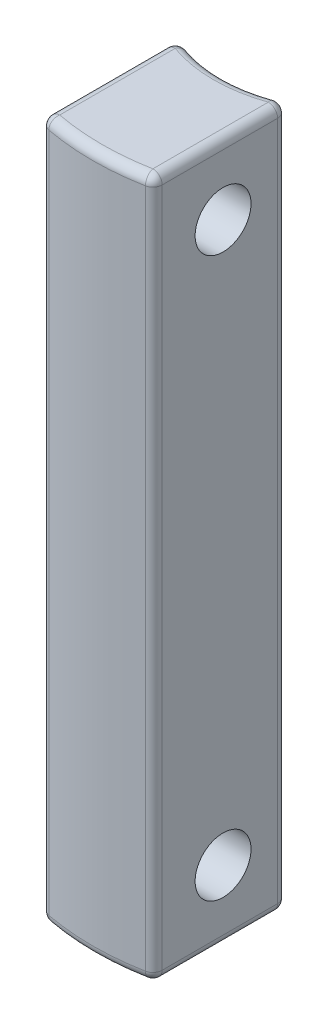
ISO-10303-21;
HEADER;
FILE_DESCRIPTION(('STEP AP214'),'2;1');
FILE_NAME('part.step','',(''),(''),'','','');
FILE_SCHEMA(('AUTOMOTIVE_DESIGN { 1 0 10303 214 1 1 1 1 }'));
ENDSEC;
DATA;
#1=APPLICATION_CONTEXT('core data for automotive mechanical design processes');
#2=APPLICATION_PROTOCOL_DEFINITION('international standard','automotive_design',2000,#1);
#3=PRODUCT_CONTEXT('',#1,'mechanical');
#4=PRODUCT('Part','Part','',(#3));
#5=PRODUCT_RELATED_PRODUCT_CATEGORY('part','',(#4));
#6=PRODUCT_DEFINITION_FORMATION('','',#4);
#7=PRODUCT_DEFINITION_CONTEXT('part definition',#1,'design');
#8=PRODUCT_DEFINITION('design','',#6,#7);
#9=PRODUCT_DEFINITION_SHAPE('','',#8);
#10=(LENGTH_UNIT() NAMED_UNIT(*) SI_UNIT(.MILLI.,.METRE.));
#11=(NAMED_UNIT(*) PLANE_ANGLE_UNIT() SI_UNIT($,.RADIAN.));
#12=(NAMED_UNIT(*) SI_UNIT($,.STERADIAN.) SOLID_ANGLE_UNIT());
#13=UNCERTAINTY_MEASURE_WITH_UNIT(LENGTH_MEASURE(1.E-05),#10,'distance_accuracy_value','');
#14=(GEOMETRIC_REPRESENTATION_CONTEXT(3) GLOBAL_UNCERTAINTY_ASSIGNED_CONTEXT((#13)) GLOBAL_UNIT_ASSIGNED_CONTEXT((#10,
#11,#12)) REPRESENTATION_CONTEXT('',''));
#15=CARTESIAN_POINT('',(0.,0.,0.));
#16=DIRECTION('',(0.,0.,1.));
#17=DIRECTION('',(1.,0.,0.));
#18=AXIS2_PLACEMENT_3D('',#15,#16,#17);
#19=CARTESIAN_POINT('',(0.,37.5,-19.9993496515141));
#20=DIRECTION('',(0.,-1.,0.));
#21=DIRECTION('',(0.,0.,-1.));
#22=AXIS2_PLACEMENT_3D('',#19,#20,#21);
#23=CYLINDRICAL_SURFACE('',#22,28.);
#24=CARTESIAN_POINT('',(0.,36.5,-19.9993496515141));
#25=DIRECTION('',(0.,1.,0.));
#26=DIRECTION('',(0.,0.,1.));
#27=AXIS2_PLACEMENT_3D('',#24,#25,#26);
#28=CIRCLE('',#27,28.);
#29=CARTESIAN_POINT('',(5.1851851851852,36.5,7.51635231291588));
#30=VERTEX_POINT('',#29);
#31=CARTESIAN_POINT('',(-5.18518518518519,36.5,7.51635231291588));
#32=VERTEX_POINT('',#31);
#33=EDGE_CURVE('E44',#30,#32,#28,.F.);
#34=ORIENTED_EDGE('',*,*,#33,.T.);
#35=DIRECTION('',(0.,-1.,0.));
#36=VECTOR('',#35,1.);
#37=CARTESIAN_POINT('',(-5.18518518518519,37.5,7.51635231291588));
#38=LINE('',#37,#36);
#39=CARTESIAN_POINT('',(-5.18518518518519,-36.5,7.51635231291588));
#40=VERTEX_POINT('',#39);
#41=EDGE_CURVE('E11',#32,#40,#38,.T.);
#42=ORIENTED_EDGE('',*,*,#41,.T.);
#43=CARTESIAN_POINT('',(0.,-36.5,-19.9993496515141));
#44=DIRECTION('',(0.,1.,0.));
#45=DIRECTION('',(0.,0.,1.));
#46=AXIS2_PLACEMENT_3D('',#43,#44,#45);
#47=CIRCLE('',#46,28.);
#48=CARTESIAN_POINT('',(5.1851851851852,-36.5,7.51635231291588));
#49=VERTEX_POINT('',#48);
#50=EDGE_CURVE('E206',#40,#49,#47,.T.);
#51=ORIENTED_EDGE('',*,*,#50,.T.);
#52=DIRECTION('',(0.,-1.,0.));
#53=VECTOR('',#52,1.);
#54=CARTESIAN_POINT('',(5.1851851851852,37.5,7.51635231291588));
#55=LINE('',#54,#53);
#56=EDGE_CURVE('E55',#49,#30,#55,.F.);
#57=ORIENTED_EDGE('',*,*,#56,.T.);
#58=EDGE_LOOP('',(#34,#42,#51,#57));
#59=FACE_BOUND('',#58,.T.);
#60=ADVANCED_FACE('F35',(#59),#23,.T.);
#61=CARTESIAN_POINT('',(6.00000000000001,37.5,7.35023901084058));
#62=DIRECTION('',(-1.,0.,0.));
#63=DIRECTION('',(0.,0.,1.));
#64=AXIS2_PLACEMENT_3D('',#61,#62,#63);
#65=PLANE('',#64);
#66=DIRECTION('',(0.,0.,-1.));
#67=VECTOR('',#66,1.);
#68=CARTESIAN_POINT('',(6.00000000000001,-36.5,7.35023901084058));
#69=LINE('',#68,#67);
#70=CARTESIAN_POINT('',(6.00000000000001,-36.5,6.53364867132909));
#71=VERTEX_POINT('',#70);
#72=CARTESIAN_POINT('',(6.00000000000001,-36.5,-5.85721402778315));
#73=VERTEX_POINT('',#72);
#74=EDGE_CURVE('E176',#71,#73,#69,.T.);
#75=ORIENTED_EDGE('',*,*,#74,.T.);
#76=DIRECTION('',(0.,-1.,0.));
#77=VECTOR('',#76,1.);
#78=CARTESIAN_POINT('',(6.00000000000001,37.5,-5.85721402778315));
#79=LINE('',#78,#77);
#80=CARTESIAN_POINT('',(6.00000000000001,36.5,-5.85721402778315));
#81=VERTEX_POINT('',#80);
#82=EDGE_CURVE('E178',#73,#81,#79,.F.);
#83=ORIENTED_EDGE('',*,*,#82,.T.);
#84=DIRECTION('',(0.,0.,-1.));
#85=VECTOR('',#84,1.);
#86=CARTESIAN_POINT('',(6.00000000000001,36.5,7.35023901084058));
#87=LINE('',#86,#85);
#88=CARTESIAN_POINT('',(6.00000000000001,36.5,6.53364867132909));
#89=VERTEX_POINT('',#88);
#90=EDGE_CURVE('E174',#81,#89,#87,.F.);
#91=ORIENTED_EDGE('',*,*,#90,.T.);
#92=DIRECTION('',(0.,-1.,0.));
#93=VECTOR('',#92,1.);
#94=CARTESIAN_POINT('',(6.00000000000001,37.5,6.53364867132909));
#95=LINE('',#94,#93);
#96=EDGE_CURVE('E172',#89,#71,#95,.T.);
#97=ORIENTED_EDGE('',*,*,#96,.T.);
#98=EDGE_LOOP('',(#75,#83,#91,#97));
#99=FACE_BOUND('',#98,.T.);
#100=CARTESIAN_POINT('',(6.00000000000001,30.,0.));
#101=DIRECTION('',(1.,0.,0.));
#102=DIRECTION('',(0.,0.,-1.));
#103=AXIS2_PLACEMENT_3D('',#100,#101,#102);
#104=CIRCLE('',#103,3.);
#105=CARTESIAN_POINT('',(6.00000000000001,30.,-3.00000000000001));
#106=VERTEX_POINT('',#105);
#107=EDGE_CURVE('E164',#106,#106,#104,.T.);
#108=ORIENTED_EDGE('',*,*,#107,.F.);
#109=EDGE_LOOP('',(#108));
#110=FACE_BOUND('',#109,.T.);
#111=CARTESIAN_POINT('',(6.00000000000001,-30.,0.));
#112=DIRECTION('',(1.,0.,0.));
#113=DIRECTION('',(0.,0.,-1.));
#114=AXIS2_PLACEMENT_3D('',#111,#112,#113);
#115=CIRCLE('',#114,3.);
#116=CARTESIAN_POINT('',(6.00000000000001,-30.,-3.00000000000001));
#117=VERTEX_POINT('',#116);
#118=EDGE_CURVE('E264',#117,#117,#115,.T.);
#119=ORIENTED_EDGE('',*,*,#118,.F.);
#120=EDGE_LOOP('',(#119));
#121=FACE_BOUND('',#120,.T.);
#122=ADVANCED_FACE('F279',(#99,#110,#121),#65,.F.);
#123=CARTESIAN_POINT('',(0.,37.5,-19.9993496515141));
#124=DIRECTION('',(0.,-1.,0.));
#125=DIRECTION('',(0.,0.,-1.));
#126=AXIS2_PLACEMENT_3D('',#123,#124,#125);
#127=CYLINDRICAL_SURFACE('',#126,14.);
#128=DIRECTION('',(0.,-1.,0.));
#129=VECTOR('',#128,1.);
#130=CARTESIAN_POINT('',(4.66666666666667,37.5,-6.80002306936522));
#131=LINE('',#130,#129);
#132=CARTESIAN_POINT('',(4.66666666666667,36.5,-6.80002306936522));
#133=VERTEX_POINT('',#132);
#134=CARTESIAN_POINT('',(4.66666666666667,-36.5,-6.80002306936522));
#135=VERTEX_POINT('',#134);
#136=EDGE_CURVE('E134',#133,#135,#131,.T.);
#137=ORIENTED_EDGE('',*,*,#136,.T.);
#138=CARTESIAN_POINT('',(0.,-36.5,-19.9993496515141));
#139=DIRECTION('',(0.,1.,0.));
#140=DIRECTION('',(0.,0.,1.));
#141=AXIS2_PLACEMENT_3D('',#138,#139,#140);
#142=CIRCLE('',#141,14.);
#143=CARTESIAN_POINT('',(-4.66666666666667,-36.5,-6.80002306936521));
#144=VERTEX_POINT('',#143);
#145=EDGE_CURVE('E130',#135,#144,#142,.F.);
#146=ORIENTED_EDGE('',*,*,#145,.T.);
#147=DIRECTION('',(0.,-1.,0.));
#148=VECTOR('',#147,1.);
#149=CARTESIAN_POINT('',(-4.66666666666667,37.5,-6.80002306936521));
#150=LINE('',#149,#148);
#151=CARTESIAN_POINT('',(-4.66666666666667,36.5,-6.80002306936521));
#152=VERTEX_POINT('',#151);
#153=EDGE_CURVE('E122',#144,#152,#150,.F.);
#154=ORIENTED_EDGE('',*,*,#153,.T.);
#155=CARTESIAN_POINT('',(0.,36.5,-19.9993496515141));
#156=DIRECTION('',(0.,1.,0.));
#157=DIRECTION('',(0.,0.,1.));
#158=AXIS2_PLACEMENT_3D('',#155,#156,#157);
#159=CIRCLE('',#158,14.);
#160=EDGE_CURVE('E127',#152,#133,#159,.T.);
#161=ORIENTED_EDGE('',*,*,#160,.T.);
#162=EDGE_LOOP('',(#137,#146,#154,#161));
#163=FACE_BOUND('',#162,.T.);
#164=ADVANCED_FACE('F125',(#163),#127,.F.);
#165=CARTESIAN_POINT('',(-6.,37.5,7.35023901084058));
#166=DIRECTION('',(1.,0.,0.));
#167=DIRECTION('',(0.,0.,-1.));
#168=AXIS2_PLACEMENT_3D('',#165,#166,#167);
#169=PLANE('',#168);
#170=DIRECTION('',(0.,0.,1.));
#171=VECTOR('',#170,1.);
#172=CARTESIAN_POINT('',(-6.,36.5,-7.35023901084058));
#173=LINE('',#172,#171);
#174=CARTESIAN_POINT('',(-6.,36.5,6.5336486713291));
#175=VERTEX_POINT('',#174);
#176=CARTESIAN_POINT('',(-6.,36.5,-5.85721402778315));
#177=VERTEX_POINT('',#176);
#178=EDGE_CURVE('E183',#175,#177,#173,.F.);
#179=ORIENTED_EDGE('',*,*,#178,.T.);
#180=DIRECTION('',(0.,-1.,0.));
#181=VECTOR('',#180,1.);
#182=CARTESIAN_POINT('',(-6.,37.5,-5.85721402778315));
#183=LINE('',#182,#181);
#184=CARTESIAN_POINT('',(-6.,-36.5,-5.85721402778315));
#185=VERTEX_POINT('',#184);
#186=EDGE_CURVE('E142',#177,#185,#183,.T.);
#187=ORIENTED_EDGE('',*,*,#186,.T.);
#188=DIRECTION('',(0.,0.,1.));
#189=VECTOR('',#188,1.);
#190=CARTESIAN_POINT('',(-6.,-36.5,7.35023901084058));
#191=LINE('',#190,#189);
#192=CARTESIAN_POINT('',(-6.,-36.5,6.5336486713291));
#193=VERTEX_POINT('',#192);
#194=EDGE_CURVE('E185',#185,#193,#191,.T.);
#195=ORIENTED_EDGE('',*,*,#194,.T.);
#196=DIRECTION('',(0.,-1.,0.));
#197=VECTOR('',#196,1.);
#198=CARTESIAN_POINT('',(-6.,37.5,6.5336486713291));
#199=LINE('',#198,#197);
#200=EDGE_CURVE('E181',#193,#175,#199,.F.);
#201=ORIENTED_EDGE('',*,*,#200,.T.);
#202=EDGE_LOOP('',(#179,#187,#195,#201));
#203=FACE_BOUND('',#202,.T.);
#204=CARTESIAN_POINT('',(-6.,30.,0.));
#205=DIRECTION('',(1.,0.,0.));
#206=DIRECTION('',(0.,0.,-1.));
#207=AXIS2_PLACEMENT_3D('',#204,#205,#206);
#208=CIRCLE('',#207,3.);
#209=CARTESIAN_POINT('',(-6.,30.,-3.00000000000001));
#210=VERTEX_POINT('',#209);
#211=EDGE_CURVE('E161',#210,#210,#208,.T.);
#212=ORIENTED_EDGE('',*,*,#211,.T.);
#213=EDGE_LOOP('',(#212));
#214=FACE_BOUND('',#213,.T.);
#215=CARTESIAN_POINT('',(-6.,-30.,0.));
#216=DIRECTION('',(1.,0.,0.));
#217=DIRECTION('',(0.,0.,-1.));
#218=AXIS2_PLACEMENT_3D('',#215,#216,#217);
#219=CIRCLE('',#218,3.);
#220=CARTESIAN_POINT('',(-6.,-30.,-3.00000000000001));
#221=VERTEX_POINT('',#220);
#222=EDGE_CURVE('E167',#221,#221,#219,.T.);
#223=ORIENTED_EDGE('',*,*,#222,.T.);
#224=EDGE_LOOP('',(#223));
#225=FACE_BOUND('',#224,.T.);
#226=ADVANCED_FACE('F288',(#203,#214,#225),#169,.F.);
#227=CARTESIAN_POINT('',(0.,37.5,-19.9993496515141));
#228=DIRECTION('',(0.,1.,0.));
#229=DIRECTION('',(0.,0.,1.));
#230=AXIS2_PLACEMENT_3D('',#227,#228,#229);
#231=PLANE('',#230);
#232=CARTESIAN_POINT('',(0.,37.5,-19.9993496515141));
#233=DIRECTION('',(0.,1.,0.));
#234=DIRECTION('',(0.,0.,1.));
#235=AXIS2_PLACEMENT_3D('',#232,#233,#234);
#236=CIRCLE('',#235,15.);
#237=CARTESIAN_POINT('',(5.00000000000001,37.5,-5.85721402778315));
#238=VERTEX_POINT('',#237);
#239=CARTESIAN_POINT('',(-5.,37.5,-5.85721402778315));
#240=VERTEX_POINT('',#239);
#241=EDGE_CURVE('E201',#238,#240,#236,.F.);
#242=ORIENTED_EDGE('',*,*,#241,.T.);
#243=DIRECTION('',(0.,0.,1.));
#244=VECTOR('',#243,1.);
#245=CARTESIAN_POINT('',(-5.,37.5,7.35023901084058));
#246=LINE('',#245,#244);
#247=CARTESIAN_POINT('',(-5.,37.5,6.5336486713291));
#248=VERTEX_POINT('',#247);
#249=EDGE_CURVE('E203',#240,#248,#246,.T.);
#250=ORIENTED_EDGE('',*,*,#249,.T.);
#251=CARTESIAN_POINT('',(0.,37.5,-19.9993496515141));
#252=DIRECTION('',(0.,1.,0.));
#253=DIRECTION('',(0.,0.,1.));
#254=AXIS2_PLACEMENT_3D('',#251,#252,#253);
#255=CIRCLE('',#254,27.);
#256=CARTESIAN_POINT('',(5.00000000000001,37.5,6.5336486713291));
#257=VERTEX_POINT('',#256);
#258=EDGE_CURVE('E197',#248,#257,#255,.T.);
#259=ORIENTED_EDGE('',*,*,#258,.T.);
#260=DIRECTION('',(0.,0.,-1.));
#261=VECTOR('',#260,1.);
#262=CARTESIAN_POINT('',(5.00000000000001,37.5,-7.35023901084059));
#263=LINE('',#262,#261);
#264=EDGE_CURVE('E199',#257,#238,#263,.T.);
#265=ORIENTED_EDGE('',*,*,#264,.T.);
#266=EDGE_LOOP('',(#242,#250,#259,#265));
#267=FACE_BOUND('',#266,.T.);
#268=ADVANCED_FACE('F385',(#267),#231,.T.);
#269=CARTESIAN_POINT('',(0.,-37.5,-19.9993496515141));
#270=DIRECTION('',(0.,1.,0.));
#271=DIRECTION('',(0.,0.,1.));
#272=AXIS2_PLACEMENT_3D('',#269,#270,#271);
#273=PLANE('',#272);
#274=CARTESIAN_POINT('',(0.,-37.5,-19.9993496515141));
#275=DIRECTION('',(0.,1.,0.));
#276=DIRECTION('',(0.,0.,1.));
#277=AXIS2_PLACEMENT_3D('',#274,#275,#276);
#278=CIRCLE('',#277,15.);
#279=CARTESIAN_POINT('',(-5.,-37.5,-5.85721402778315));
#280=VERTEX_POINT('',#279);
#281=CARTESIAN_POINT('',(5.00000000000001,-37.5,-5.85721402778315));
#282=VERTEX_POINT('',#281);
#283=EDGE_CURVE('E192',#280,#282,#278,.T.);
#284=ORIENTED_EDGE('',*,*,#283,.T.);
#285=DIRECTION('',(0.,0.,-1.));
#286=VECTOR('',#285,1.);
#287=CARTESIAN_POINT('',(5.,-37.5,-19.9993496515141));
#288=LINE('',#287,#286);
#289=CARTESIAN_POINT('',(5.00000000000001,-37.5,6.5336486713291));
#290=VERTEX_POINT('',#289);
#291=EDGE_CURVE('E194',#282,#290,#288,.F.);
#292=ORIENTED_EDGE('',*,*,#291,.T.);
#293=CARTESIAN_POINT('',(0.,-37.5,-19.9993496515141));
#294=DIRECTION('',(0.,1.,0.));
#295=DIRECTION('',(0.,0.,1.));
#296=AXIS2_PLACEMENT_3D('',#293,#294,#295);
#297=CIRCLE('',#296,27.);
#298=CARTESIAN_POINT('',(-5.,-37.5,6.5336486713291));
#299=VERTEX_POINT('',#298);
#300=EDGE_CURVE('E188',#290,#299,#297,.F.);
#301=ORIENTED_EDGE('',*,*,#300,.T.);
#302=DIRECTION('',(0.,0.,1.));
#303=VECTOR('',#302,1.);
#304=CARTESIAN_POINT('',(-5.,-37.5,-19.9993496515141));
#305=LINE('',#304,#303);
#306=EDGE_CURVE('E190',#299,#280,#305,.F.);
#307=ORIENTED_EDGE('',*,*,#306,.T.);
#308=EDGE_LOOP('',(#284,#292,#301,#307));
#309=FACE_BOUND('',#308,.T.);
#310=ADVANCED_FACE('F387',(#309),#273,.F.);
#311=CARTESIAN_POINT('',(-6.,-30.,0.));
#312=DIRECTION('',(1.,0.,0.));
#313=DIRECTION('',(0.,0.,-1.));
#314=AXIS2_PLACEMENT_3D('',#311,#312,#313);
#315=CYLINDRICAL_SURFACE('',#314,3.);
#316=ORIENTED_EDGE('',*,*,#222,.F.);
#317=EDGE_LOOP('',(#316));
#318=FACE_BOUND('',#317,.T.);
#319=ORIENTED_EDGE('',*,*,#118,.T.);
#320=EDGE_LOOP('',(#319));
#321=FACE_BOUND('',#320,.T.);
#322=ADVANCED_FACE('F393',(#318,#321),#315,.F.);
#323=CARTESIAN_POINT('',(-6.,30.,0.));
#324=DIRECTION('',(1.,0.,0.));
#325=DIRECTION('',(0.,0.,-1.));
#326=AXIS2_PLACEMENT_3D('',#323,#324,#325);
#327=CYLINDRICAL_SURFACE('',#326,3.);
#328=ORIENTED_EDGE('',*,*,#211,.F.);
#329=EDGE_LOOP('',(#328));
#330=FACE_BOUND('',#329,.T.);
#331=ORIENTED_EDGE('',*,*,#107,.T.);
#332=EDGE_LOOP('',(#331));
#333=FACE_BOUND('',#332,.T.);
#334=ADVANCED_FACE('F277',(#330,#333),#327,.F.);
#335=CARTESIAN_POINT('',(-5.,37.5,6.5336486713291));
#336=DIRECTION('',(0.,-1.,0.));
#337=DIRECTION('',(0.,0.,-1.));
#338=AXIS2_PLACEMENT_3D('',#335,#336,#337);
#339=CYLINDRICAL_SURFACE('',#338,1.);
#340=CARTESIAN_POINT('',(-5.,36.5,6.5336486713291));
#341=DIRECTION('',(0.,1.,0.));
#342=DIRECTION('',(0.,0.,1.));
#343=AXIS2_PLACEMENT_3D('',#340,#341,#342);
#344=CIRCLE('',#343,1.);
#345=EDGE_CURVE('E39',#175,#32,#344,.T.);
#346=ORIENTED_EDGE('',*,*,#345,.F.);
#347=ORIENTED_EDGE('',*,*,#200,.F.);
#348=CARTESIAN_POINT('',(-5.,-36.5,6.5336486713291));
#349=DIRECTION('',(0.,-1.,0.));
#350=DIRECTION('',(0.,0.,-1.));
#351=AXIS2_PLACEMENT_3D('',#348,#349,#350);
#352=CIRCLE('',#351,1.);
#353=EDGE_CURVE('E257',#40,#193,#352,.T.);
#354=ORIENTED_EDGE('',*,*,#353,.F.);
#355=ORIENTED_EDGE('',*,*,#41,.F.);
#356=EDGE_LOOP('',(#346,#347,#354,#355));
#357=FACE_BOUND('',#356,.T.);
#358=ADVANCED_FACE('F37',(#357),#339,.T.);
#359=CARTESIAN_POINT('',(-5.,36.5,6.5336486713291));
#360=DIRECTION('',(0.,1.,0.));
#361=DIRECTION('',(0.,0.,1.));
#362=AXIS2_PLACEMENT_3D('',#359,#360,#361);
#363=SPHERICAL_SURFACE('',#362,1.);
#364=CARTESIAN_POINT('',(-5.,36.5,6.5336486713291));
#365=DIRECTION('',(0.,0.,1.));
#366=DIRECTION('',(1.,0.,0.));
#367=AXIS2_PLACEMENT_3D('',#364,#365,#366);
#368=CIRCLE('',#367,1.);
#369=EDGE_CURVE('E252',#175,#248,#368,.F.);
#370=ORIENTED_EDGE('',*,*,#369,.F.);
#371=ORIENTED_EDGE('',*,*,#345,.T.);
#372=CARTESIAN_POINT('',(-5.,36.5,6.5336486713291));
#373=DIRECTION('',(-0.982703641586785,0.,-0.185185185185185));
#374=DIRECTION('',(-0.185185185185185,0.,0.982703641586785));
#375=AXIS2_PLACEMENT_3D('',#372,#373,#374);
#376=CIRCLE('',#375,1.);
#377=EDGE_CURVE('E255',#248,#32,#376,.F.);
#378=ORIENTED_EDGE('',*,*,#377,.F.);
#379=EDGE_LOOP('',(#370,#371,#378));
#380=FACE_BOUND('',#379,.T.);
#381=ADVANCED_FACE('F357',(#380),#363,.T.);
#382=CARTESIAN_POINT('',(-5.,-36.5,6.5336486713291));
#383=DIRECTION('',(0.,-1.,0.));
#384=DIRECTION('',(0.,0.,-1.));
#385=AXIS2_PLACEMENT_3D('',#382,#383,#384);
#386=SPHERICAL_SURFACE('',#385,1.);
#387=CARTESIAN_POINT('',(-5.,-36.5,6.5336486713291));
#388=DIRECTION('',(-0.982703641586785,0.,-0.185185185185185));
#389=DIRECTION('',(-0.185185185185185,0.,0.982703641586785));
#390=AXIS2_PLACEMENT_3D('',#387,#388,#389);
#391=CIRCLE('',#390,1.);
#392=EDGE_CURVE('E246',#40,#299,#391,.F.);
#393=ORIENTED_EDGE('',*,*,#392,.F.);
#394=ORIENTED_EDGE('',*,*,#353,.T.);
#395=CARTESIAN_POINT('',(-5.,-36.5,6.5336486713291));
#396=DIRECTION('',(0.,0.,1.));
#397=DIRECTION('',(0.,-1.,0.));
#398=AXIS2_PLACEMENT_3D('',#395,#396,#397);
#399=CIRCLE('',#398,1.);
#400=EDGE_CURVE('E249',#299,#193,#399,.F.);
#401=ORIENTED_EDGE('',*,*,#400,.F.);
#402=EDGE_LOOP('',(#393,#394,#401));
#403=FACE_BOUND('',#402,.T.);
#404=ADVANCED_FACE('F354',(#403),#386,.T.);
#405=CARTESIAN_POINT('',(0.,36.5,-19.9993496515141));
#406=DIRECTION('',(0.,1.,0.));
#407=DIRECTION('',(0.,0.,1.));
#408=AXIS2_PLACEMENT_3D('',#405,#406,#407);
#409=TOROIDAL_SURFACE('',#408,27.,1.);
#410=ORIENTED_EDGE('',*,*,#377,.T.);
#411=ORIENTED_EDGE('',*,*,#33,.F.);
#412=CARTESIAN_POINT('',(5.00000000000001,36.5,6.5336486713291));
#413=DIRECTION('',(0.982703641586785,0.,-0.185185185185186));
#414=DIRECTION('',(-0.185185185185186,0.,-0.982703641586785));
#415=AXIS2_PLACEMENT_3D('',#412,#413,#414);
#416=CIRCLE('',#415,1.);
#417=EDGE_CURVE('E240',#257,#30,#416,.T.);
#418=ORIENTED_EDGE('',*,*,#417,.F.);
#419=ORIENTED_EDGE('',*,*,#258,.F.);
#420=EDGE_LOOP('',(#410,#411,#418,#419));
#421=FACE_BOUND('',#420,.T.);
#422=ADVANCED_FACE('F350',(#421),#409,.T.);
#423=CARTESIAN_POINT('',(-5.,36.5,-19.9993496515141));
#424=DIRECTION('',(0.,0.,-1.));
#425=DIRECTION('',(-1.,0.,0.));
#426=AXIS2_PLACEMENT_3D('',#423,#424,#425);
#427=CYLINDRICAL_SURFACE('',#426,1.);
#428=ORIENTED_EDGE('',*,*,#369,.T.);
#429=ORIENTED_EDGE('',*,*,#249,.F.);
#430=CARTESIAN_POINT('',(-5.,36.5,-5.85721402778315));
#431=DIRECTION('',(0.,0.,-1.));
#432=DIRECTION('',(0.,1.,0.));
#433=AXIS2_PLACEMENT_3D('',#430,#431,#432);
#434=CIRCLE('',#433,1.);
#435=EDGE_CURVE('E146',#177,#240,#434,.T.);
#436=ORIENTED_EDGE('',*,*,#435,.F.);
#437=ORIENTED_EDGE('',*,*,#178,.F.);
#438=EDGE_LOOP('',(#428,#429,#436,#437));
#439=FACE_BOUND('',#438,.T.);
#440=ADVANCED_FACE('F347',(#439),#427,.T.);
#441=CARTESIAN_POINT('',(-5.,37.5,-5.85721402778315));
#442=DIRECTION('',(0.,-1.,0.));
#443=DIRECTION('',(0.,0.,-1.));
#444=AXIS2_PLACEMENT_3D('',#441,#442,#443);
#445=CYLINDRICAL_SURFACE('',#444,1.);
#446=CARTESIAN_POINT('',(-5.,-36.5,-5.85721402778315));
#447=DIRECTION('',(0.,-1.,0.));
#448=DIRECTION('',(0.,0.,-1.));
#449=AXIS2_PLACEMENT_3D('',#446,#447,#448);
#450=CIRCLE('',#449,1.);
#451=EDGE_CURVE('E147',#185,#144,#450,.T.);
#452=ORIENTED_EDGE('',*,*,#451,.F.);
#453=ORIENTED_EDGE('',*,*,#186,.F.);
#454=CARTESIAN_POINT('',(-5.,36.5,-5.85721402778315));
#455=DIRECTION('',(0.,1.,0.));
#456=DIRECTION('',(0.,0.,1.));
#457=AXIS2_PLACEMENT_3D('',#454,#455,#456);
#458=CIRCLE('',#457,1.);
#459=EDGE_CURVE('E138',#152,#177,#458,.T.);
#460=ORIENTED_EDGE('',*,*,#459,.F.);
#461=ORIENTED_EDGE('',*,*,#153,.F.);
#462=EDGE_LOOP('',(#452,#453,#460,#461));
#463=FACE_BOUND('',#462,.T.);
#464=ADVANCED_FACE('F140',(#463),#445,.T.);
#465=CARTESIAN_POINT('',(-5.,-36.5,7.35023901084058));
#466=DIRECTION('',(0.,0.,1.));
#467=DIRECTION('',(1.,0.,0.));
#468=AXIS2_PLACEMENT_3D('',#465,#466,#467);
#469=CYLINDRICAL_SURFACE('',#468,1.);
#470=ORIENTED_EDGE('',*,*,#400,.T.);
#471=ORIENTED_EDGE('',*,*,#194,.F.);
#472=CARTESIAN_POINT('',(-5.,-36.5,-5.85721402778315));
#473=DIRECTION('',(0.,0.,-1.));
#474=DIRECTION('',(-1.,0.,0.));
#475=AXIS2_PLACEMENT_3D('',#472,#473,#474);
#476=CIRCLE('',#475,1.);
#477=EDGE_CURVE('E236',#280,#185,#476,.T.);
#478=ORIENTED_EDGE('',*,*,#477,.F.);
#479=ORIENTED_EDGE('',*,*,#306,.F.);
#480=EDGE_LOOP('',(#470,#471,#478,#479));
#481=FACE_BOUND('',#480,.T.);
#482=ADVANCED_FACE('F340',(#481),#469,.T.);
#483=CARTESIAN_POINT('',(0.,-36.5,-19.9993496515141));
#484=DIRECTION('',(0.,1.,0.));
#485=DIRECTION('',(0.,0.,1.));
#486=AXIS2_PLACEMENT_3D('',#483,#484,#485);
#487=TOROIDAL_SURFACE('',#486,27.,1.);
#488=ORIENTED_EDGE('',*,*,#392,.T.);
#489=ORIENTED_EDGE('',*,*,#300,.F.);
#490=CARTESIAN_POINT('',(5.00000000000001,-36.5,6.53364867132909));
#491=DIRECTION('',(0.982703641586785,0.,-0.185185185185186));
#492=DIRECTION('',(-0.185185185185186,0.,-0.982703641586785));
#493=AXIS2_PLACEMENT_3D('',#490,#491,#492);
#494=CIRCLE('',#493,1.);
#495=EDGE_CURVE('E233',#49,#290,#494,.T.);
#496=ORIENTED_EDGE('',*,*,#495,.F.);
#497=ORIENTED_EDGE('',*,*,#50,.F.);
#498=EDGE_LOOP('',(#488,#489,#496,#497));
#499=FACE_BOUND('',#498,.T.);
#500=ADVANCED_FACE('F336',(#499),#487,.T.);
#501=CARTESIAN_POINT('',(5.00000000000001,37.5,6.53364867132909));
#502=DIRECTION('',(0.,-1.,0.));
#503=DIRECTION('',(0.,0.,-1.));
#504=AXIS2_PLACEMENT_3D('',#501,#502,#503);
#505=CYLINDRICAL_SURFACE('',#504,1.);
#506=CARTESIAN_POINT('',(5.00000000000001,36.5,6.53364867132909));
#507=DIRECTION('',(0.,1.,0.));
#508=DIRECTION('',(0.,0.,1.));
#509=AXIS2_PLACEMENT_3D('',#506,#507,#508);
#510=CIRCLE('',#509,1.);
#511=EDGE_CURVE('E243',#30,#89,#510,.T.);
#512=ORIENTED_EDGE('',*,*,#511,.F.);
#513=ORIENTED_EDGE('',*,*,#56,.F.);
#514=CARTESIAN_POINT('',(5.00000000000001,-36.5,6.53364867132909));
#515=DIRECTION('',(0.,-1.,0.));
#516=DIRECTION('',(0.,0.,-1.));
#517=AXIS2_PLACEMENT_3D('',#514,#515,#516);
#518=CIRCLE('',#517,1.);
#519=EDGE_CURVE('E230',#71,#49,#518,.T.);
#520=ORIENTED_EDGE('',*,*,#519,.F.);
#521=ORIENTED_EDGE('',*,*,#96,.F.);
#522=EDGE_LOOP('',(#512,#513,#520,#521));
#523=FACE_BOUND('',#522,.T.);
#524=ADVANCED_FACE('F332',(#523),#505,.T.);
#525=CARTESIAN_POINT('',(5.00000000000001,36.5,6.5336486713291));
#526=DIRECTION('',(0.,1.,0.));
#527=DIRECTION('',(0.,0.,1.));
#528=AXIS2_PLACEMENT_3D('',#525,#526,#527);
#529=SPHERICAL_SURFACE('',#528,1.);
#530=ORIENTED_EDGE('',*,*,#417,.T.);
#531=ORIENTED_EDGE('',*,*,#511,.T.);
#532=CARTESIAN_POINT('',(5.00000000000001,36.5,6.53364867132909));
#533=DIRECTION('',(0.,0.,1.));
#534=DIRECTION('',(0.,-1.,0.));
#535=AXIS2_PLACEMENT_3D('',#532,#533,#534);
#536=CIRCLE('',#535,1.);
#537=EDGE_CURVE('E154',#257,#89,#536,.F.);
#538=ORIENTED_EDGE('',*,*,#537,.F.);
#539=EDGE_LOOP('',(#530,#531,#538));
#540=FACE_BOUND('',#539,.T.);
#541=ADVANCED_FACE('F329',(#540),#529,.T.);
#542=CARTESIAN_POINT('',(-5.,36.5,-5.85721402778315));
#543=DIRECTION('',(0.,1.,0.));
#544=DIRECTION('',(0.,0.,1.));
#545=AXIS2_PLACEMENT_3D('',#542,#543,#544);
#546=SPHERICAL_SURFACE('',#545,1.);
#547=ORIENTED_EDGE('',*,*,#459,.T.);
#548=ORIENTED_EDGE('',*,*,#435,.T.);
#549=CARTESIAN_POINT('',(-5.,36.5,-5.85721402778315));
#550=DIRECTION('',(-0.942809041582063,0.,-0.333333333333334));
#551=DIRECTION('',(-0.333333333333334,0.,0.942809041582063));
#552=AXIS2_PLACEMENT_3D('',#549,#550,#551);
#553=CIRCLE('',#552,1.);
#554=EDGE_CURVE('E150',#152,#240,#553,.F.);
#555=ORIENTED_EDGE('',*,*,#554,.F.);
#556=EDGE_LOOP('',(#547,#548,#555));
#557=FACE_BOUND('',#556,.T.);
#558=ADVANCED_FACE('F151',(#557),#546,.T.);
#559=CARTESIAN_POINT('',(-5.,-36.5,-5.85721402778315));
#560=DIRECTION('',(0.,-1.,0.));
#561=DIRECTION('',(0.,0.,-1.));
#562=AXIS2_PLACEMENT_3D('',#559,#560,#561);
#563=SPHERICAL_SURFACE('',#562,1.);
#564=ORIENTED_EDGE('',*,*,#477,.T.);
#565=ORIENTED_EDGE('',*,*,#451,.T.);
#566=CARTESIAN_POINT('',(-5.,-36.5,-5.85721402778315));
#567=DIRECTION('',(-0.942809041582063,0.,-0.333333333333333));
#568=DIRECTION('',(-0.333333333333333,0.,0.942809041582063));
#569=AXIS2_PLACEMENT_3D('',#566,#567,#568);
#570=CIRCLE('',#569,1.);
#571=EDGE_CURVE('E155',#280,#144,#570,.F.);
#572=ORIENTED_EDGE('',*,*,#571,.F.);
#573=EDGE_LOOP('',(#564,#565,#572));
#574=FACE_BOUND('',#573,.T.);
#575=ADVANCED_FACE('F322',(#574),#563,.T.);
#576=CARTESIAN_POINT('',(5.00000000000001,-36.5,6.5336486713291));
#577=DIRECTION('',(0.,-1.,0.));
#578=DIRECTION('',(0.,0.,-1.));
#579=AXIS2_PLACEMENT_3D('',#576,#577,#578);
#580=SPHERICAL_SURFACE('',#579,1.);
#581=ORIENTED_EDGE('',*,*,#519,.T.);
#582=ORIENTED_EDGE('',*,*,#495,.T.);
#583=CARTESIAN_POINT('',(5.00000000000001,-36.5,6.5336486713291));
#584=DIRECTION('',(0.,0.,1.));
#585=DIRECTION('',(1.,0.,0.));
#586=AXIS2_PLACEMENT_3D('',#583,#584,#585);
#587=CIRCLE('',#586,1.);
#588=EDGE_CURVE('E224',#71,#290,#587,.F.);
#589=ORIENTED_EDGE('',*,*,#588,.F.);
#590=EDGE_LOOP('',(#581,#582,#589));
#591=FACE_BOUND('',#590,.T.);
#592=ADVANCED_FACE('F318',(#591),#580,.T.);
#593=CARTESIAN_POINT('',(5.,36.5,-19.9993496515141));
#594=DIRECTION('',(0.,0.,1.));
#595=DIRECTION('',(1.,0.,0.));
#596=AXIS2_PLACEMENT_3D('',#593,#594,#595);
#597=CYLINDRICAL_SURFACE('',#596,1.);
#598=ORIENTED_EDGE('',*,*,#537,.T.);
#599=ORIENTED_EDGE('',*,*,#90,.F.);
#600=CARTESIAN_POINT('',(5.00000000000001,36.5,-5.85721402778315));
#601=DIRECTION('',(0.,0.,-1.));
#602=DIRECTION('',(-1.,0.,0.));
#603=AXIS2_PLACEMENT_3D('',#600,#601,#602);
#604=CIRCLE('',#603,1.);
#605=EDGE_CURVE('E221',#238,#81,#604,.T.);
#606=ORIENTED_EDGE('',*,*,#605,.F.);
#607=ORIENTED_EDGE('',*,*,#264,.F.);
#608=EDGE_LOOP('',(#598,#599,#606,#607));
#609=FACE_BOUND('',#608,.T.);
#610=ADVANCED_FACE('F315',(#609),#597,.T.);
#611=CARTESIAN_POINT('',(0.,36.5,-19.9993496515141));
#612=DIRECTION('',(0.,1.,0.));
#613=DIRECTION('',(0.,0.,1.));
#614=AXIS2_PLACEMENT_3D('',#611,#612,#613);
#615=TOROIDAL_SURFACE('',#614,15.,1.);
#616=ORIENTED_EDGE('',*,*,#554,.T.);
#617=ORIENTED_EDGE('',*,*,#241,.F.);
#618=CARTESIAN_POINT('',(5.00000000000001,36.5,-5.85721402778315));
#619=DIRECTION('',(0.942809041582063,0.,-0.333333333333334));
#620=DIRECTION('',(-0.333333333333334,0.,-0.942809041582063));
#621=AXIS2_PLACEMENT_3D('',#618,#619,#620);
#622=CIRCLE('',#621,1.);
#623=EDGE_CURVE('E159',#133,#238,#622,.T.);
#624=ORIENTED_EDGE('',*,*,#623,.F.);
#625=ORIENTED_EDGE('',*,*,#160,.F.);
#626=EDGE_LOOP('',(#616,#617,#624,#625));
#627=FACE_BOUND('',#626,.T.);
#628=ADVANCED_FACE('F157',(#627),#615,.T.);
#629=CARTESIAN_POINT('',(0.,-36.5,-19.9993496515141));
#630=DIRECTION('',(0.,1.,0.));
#631=DIRECTION('',(0.,0.,1.));
#632=AXIS2_PLACEMENT_3D('',#629,#630,#631);
#633=TOROIDAL_SURFACE('',#632,15.,1.);
#634=ORIENTED_EDGE('',*,*,#571,.T.);
#635=ORIENTED_EDGE('',*,*,#145,.F.);
#636=CARTESIAN_POINT('',(5.00000000000001,-36.5,-5.85721402778315));
#637=DIRECTION('',(0.942809041582063,0.,-0.333333333333333));
#638=DIRECTION('',(-0.333333333333334,0.,-0.942809041582063));
#639=AXIS2_PLACEMENT_3D('',#636,#637,#638);
#640=CIRCLE('',#639,1.);
#641=EDGE_CURVE('E217',#282,#135,#640,.T.);
#642=ORIENTED_EDGE('',*,*,#641,.F.);
#643=ORIENTED_EDGE('',*,*,#283,.F.);
#644=EDGE_LOOP('',(#634,#635,#642,#643));
#645=FACE_BOUND('',#644,.T.);
#646=ADVANCED_FACE('F308',(#645),#633,.T.);
#647=CARTESIAN_POINT('',(5.00000000000001,-36.5,7.35023901084058));
#648=DIRECTION('',(0.,0.,-1.));
#649=DIRECTION('',(-1.,0.,0.));
#650=AXIS2_PLACEMENT_3D('',#647,#648,#649);
#651=CYLINDRICAL_SURFACE('',#650,1.);
#652=ORIENTED_EDGE('',*,*,#588,.T.);
#653=ORIENTED_EDGE('',*,*,#291,.F.);
#654=CARTESIAN_POINT('',(5.00000000000001,-36.5,-5.85721402778315));
#655=DIRECTION('',(0.,0.,-1.));
#656=DIRECTION('',(0.,1.,0.));
#657=AXIS2_PLACEMENT_3D('',#654,#655,#656);
#658=CIRCLE('',#657,1.);
#659=EDGE_CURVE('E214',#73,#282,#658,.T.);
#660=ORIENTED_EDGE('',*,*,#659,.F.);
#661=ORIENTED_EDGE('',*,*,#74,.F.);
#662=EDGE_LOOP('',(#652,#653,#660,#661));
#663=FACE_BOUND('',#662,.T.);
#664=ADVANCED_FACE('F304',(#663),#651,.T.);
#665=CARTESIAN_POINT('',(5.00000000000001,36.5,-5.85721402778315));
#666=DIRECTION('',(0.,1.,0.));
#667=DIRECTION('',(0.,0.,1.));
#668=AXIS2_PLACEMENT_3D('',#665,#666,#667);
#669=SPHERICAL_SURFACE('',#668,1.);
#670=ORIENTED_EDGE('',*,*,#623,.T.);
#671=ORIENTED_EDGE('',*,*,#605,.T.);
#672=CARTESIAN_POINT('',(5.00000000000001,36.5,-5.85721402778315));
#673=DIRECTION('',(0.,1.,0.));
#674=DIRECTION('',(0.,0.,1.));
#675=AXIS2_PLACEMENT_3D('',#672,#673,#674);
#676=CIRCLE('',#675,1.);
#677=EDGE_CURVE('E212',#133,#81,#676,.F.);
#678=ORIENTED_EDGE('',*,*,#677,.F.);
#679=EDGE_LOOP('',(#670,#671,#678));
#680=FACE_BOUND('',#679,.T.);
#681=ADVANCED_FACE('F300',(#680),#669,.T.);
#682=CARTESIAN_POINT('',(5.00000000000001,-36.5,-5.85721402778315));
#683=DIRECTION('',(0.,-1.,0.));
#684=DIRECTION('',(0.,0.,-1.));
#685=AXIS2_PLACEMENT_3D('',#682,#683,#684);
#686=SPHERICAL_SURFACE('',#685,1.);
#687=ORIENTED_EDGE('',*,*,#659,.T.);
#688=ORIENTED_EDGE('',*,*,#641,.T.);
#689=CARTESIAN_POINT('',(5.00000000000001,-36.5,-5.85721402778315));
#690=DIRECTION('',(0.,-1.,0.));
#691=DIRECTION('',(0.,0.,-1.));
#692=AXIS2_PLACEMENT_3D('',#689,#690,#691);
#693=CIRCLE('',#692,1.);
#694=EDGE_CURVE('E210',#73,#135,#693,.F.);
#695=ORIENTED_EDGE('',*,*,#694,.F.);
#696=EDGE_LOOP('',(#687,#688,#695));
#697=FACE_BOUND('',#696,.T.);
#698=ADVANCED_FACE('F296',(#697),#686,.T.);
#699=CARTESIAN_POINT('',(5.00000000000001,37.5,-5.85721402778315));
#700=DIRECTION('',(0.,-1.,0.));
#701=DIRECTION('',(0.,0.,-1.));
#702=AXIS2_PLACEMENT_3D('',#699,#700,#701);
#703=CYLINDRICAL_SURFACE('',#702,1.);
#704=ORIENTED_EDGE('',*,*,#677,.T.);
#705=ORIENTED_EDGE('',*,*,#82,.F.);
#706=ORIENTED_EDGE('',*,*,#694,.T.);
#707=ORIENTED_EDGE('',*,*,#136,.F.);
#708=EDGE_LOOP('',(#704,#705,#706,#707));
#709=FACE_BOUND('',#708,.T.);
#710=ADVANCED_FACE('F293',(#709),#703,.T.);
#711=CLOSED_SHELL('',(#60,#122,#164,#226,#268,#310,#322,#334,#358,#381,#404,#422,#440,#464,#482,
#500,#524,#541,#558,#575,#592,#610,#628,#646,#664,#681,#698,#710));
#712=MANIFOLD_SOLID_BREP('B2',#711);
#713=ADVANCED_BREP_SHAPE_REPRESENTATION('',(#18,#712),#14);
#714=SHAPE_DEFINITION_REPRESENTATION(#9,#713);
ENDSEC;
END-ISO-10303-21;
